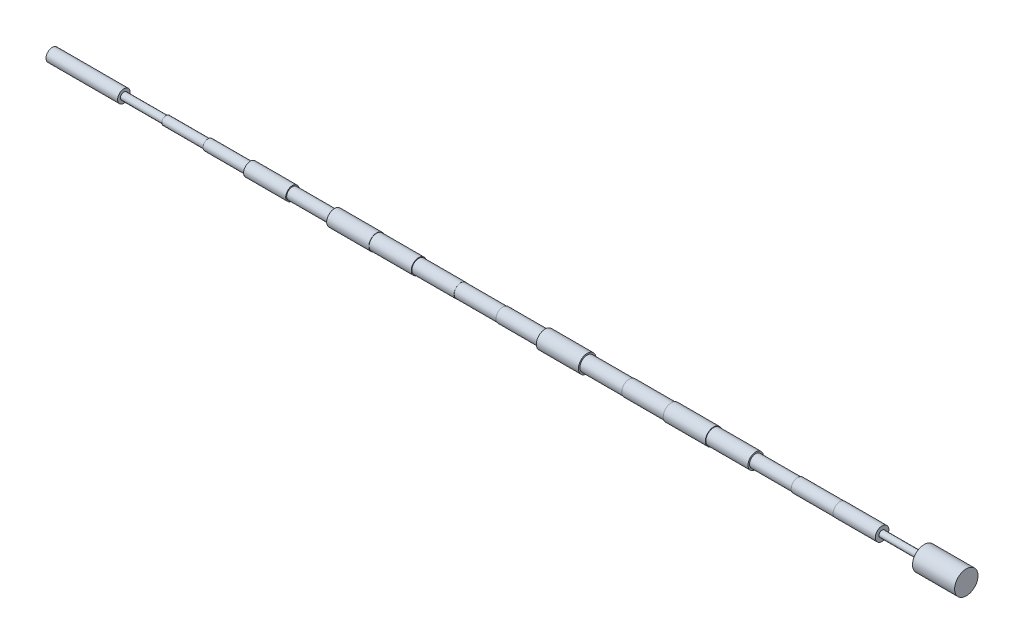
ISO-10303-21;
HEADER;
FILE_DESCRIPTION(('STEP AP214'),'2;1');
FILE_NAME('part.step','',(''),(''),'','','');
FILE_SCHEMA(('AUTOMOTIVE_DESIGN { 1 0 10303 214 1 1 1 1 }'));
ENDSEC;
DATA;
#1=APPLICATION_CONTEXT('core data for automotive mechanical design processes');
#2=APPLICATION_PROTOCOL_DEFINITION('international standard','automotive_design',2000,#1);
#3=PRODUCT_CONTEXT('',#1,'mechanical');
#4=PRODUCT('Part','Part','',(#3));
#5=PRODUCT_RELATED_PRODUCT_CATEGORY('part','',(#4));
#6=PRODUCT_DEFINITION_FORMATION('','',#4);
#7=PRODUCT_DEFINITION_CONTEXT('part definition',#1,'design');
#8=PRODUCT_DEFINITION('design','',#6,#7);
#9=PRODUCT_DEFINITION_SHAPE('','',#8);
#10=(LENGTH_UNIT() NAMED_UNIT(*) SI_UNIT(.MILLI.,.METRE.));
#11=(NAMED_UNIT(*) PLANE_ANGLE_UNIT() SI_UNIT($,.RADIAN.));
#12=(NAMED_UNIT(*) SI_UNIT($,.STERADIAN.) SOLID_ANGLE_UNIT());
#13=UNCERTAINTY_MEASURE_WITH_UNIT(LENGTH_MEASURE(1.E-05),#10,'distance_accuracy_value','');
#14=(GEOMETRIC_REPRESENTATION_CONTEXT(3) GLOBAL_UNCERTAINTY_ASSIGNED_CONTEXT((#13)) GLOBAL_UNIT_ASSIGNED_CONTEXT((#10,
#11,#12)) REPRESENTATION_CONTEXT('',''));
#15=CARTESIAN_POINT('',(0.,0.,0.));
#16=DIRECTION('',(0.,0.,1.));
#17=DIRECTION('',(1.,0.,0.));
#18=AXIS2_PLACEMENT_3D('',#15,#16,#17);
#19=CARTESIAN_POINT('',(200.,3.99073696845851E-12,0.));
#20=DIRECTION('',(-1.,0.,0.));
#21=DIRECTION('',(0.,0.,1.));
#22=AXIS2_PLACEMENT_3D('',#19,#20,#21);
#23=PLANE('',#22);
#24=CARTESIAN_POINT('',(200.,0.,0.));
#25=DIRECTION('',(-1.,0.,0.));
#26=DIRECTION('',(0.,0.,1.));
#27=AXIS2_PLACEMENT_3D('',#24,#25,#26);
#28=CIRCLE('',#27,2.782);
#29=CARTESIAN_POINT('',(200.,0.,2.782));
#30=VERTEX_POINT('',#29);
#31=EDGE_CURVE('E10',#30,#30,#28,.T.);
#32=ORIENTED_EDGE('',*,*,#31,.F.);
#33=EDGE_LOOP('',(#32));
#34=FACE_BOUND('',#33,.T.);
#35=ADVANCED_FACE('F41',(#34),#23,.F.);
#36=CARTESIAN_POINT('',(0.,0.,0.));
#37=DIRECTION('',(-1.,0.,0.));
#38=DIRECTION('',(0.,0.,1.));
#39=AXIS2_PLACEMENT_3D('',#36,#37,#38);
#40=CYLINDRICAL_SURFACE('',#39,2.782);
#41=ORIENTED_EDGE('',*,*,#31,.T.);
#42=EDGE_LOOP('',(#41));
#43=FACE_BOUND('',#42,.T.);
#44=CARTESIAN_POINT('',(190.,0.,0.));
#45=DIRECTION('',(-1.,0.,0.));
#46=DIRECTION('',(0.,0.,1.));
#47=AXIS2_PLACEMENT_3D('',#44,#45,#46);
#48=CIRCLE('',#47,2.782);
#49=CARTESIAN_POINT('',(190.,0.,2.782));
#50=VERTEX_POINT('',#49);
#51=EDGE_CURVE('E47',#50,#50,#48,.T.);
#52=ORIENTED_EDGE('',*,*,#51,.F.);
#53=EDGE_LOOP('',(#52));
#54=FACE_BOUND('',#53,.T.);
#55=ADVANCED_FACE('F193',(#43,#54),#40,.T.);
#56=CARTESIAN_POINT('',(190.,3.79120012003558E-12,0.));
#57=DIRECTION('',(-1.,0.,0.));
#58=DIRECTION('',(0.,0.,1.));
#59=AXIS2_PLACEMENT_3D('',#56,#57,#58);
#60=PLANE('',#59);
#61=ORIENTED_EDGE('',*,*,#51,.T.);
#62=EDGE_LOOP('',(#61));
#63=FACE_BOUND('',#62,.T.);
#64=CARTESIAN_POINT('',(190.,0.,0.));
#65=DIRECTION('',(-1.,0.,0.));
#66=DIRECTION('',(0.,0.,1.));
#67=AXIS2_PLACEMENT_3D('',#64,#65,#66);
#68=CIRCLE('',#67,0.738);
#69=CARTESIAN_POINT('',(190.,0.,0.738));
#70=VERTEX_POINT('',#69);
#71=EDGE_CURVE('E51',#70,#70,#68,.T.);
#72=ORIENTED_EDGE('',*,*,#71,.F.);
#73=EDGE_LOOP('',(#72));
#74=FACE_BOUND('',#73,.T.);
#75=ADVANCED_FACE('F198',(#63,#74),#60,.T.);
#76=CARTESIAN_POINT('',(0.,0.,0.));
#77=DIRECTION('',(-1.,0.,0.));
#78=DIRECTION('',(0.,0.,1.));
#79=AXIS2_PLACEMENT_3D('',#76,#77,#78);
#80=CYLINDRICAL_SURFACE('',#79,0.738);
#81=ORIENTED_EDGE('',*,*,#71,.T.);
#82=EDGE_LOOP('',(#81));
#83=FACE_BOUND('',#82,.T.);
#84=CARTESIAN_POINT('',(180.,0.,0.));
#85=DIRECTION('',(-1.,0.,0.));
#86=DIRECTION('',(0.,0.,1.));
#87=AXIS2_PLACEMENT_3D('',#84,#85,#86);
#88=CIRCLE('',#87,0.738);
#89=CARTESIAN_POINT('',(180.,0.,0.738));
#90=VERTEX_POINT('',#89);
#91=EDGE_CURVE('E55',#90,#90,#88,.T.);
#92=ORIENTED_EDGE('',*,*,#91,.F.);
#93=EDGE_LOOP('',(#92));
#94=FACE_BOUND('',#93,.T.);
#95=ADVANCED_FACE('F202',(#83,#94),#80,.T.);
#96=CARTESIAN_POINT('',(180.,6.21393483931991E-12,0.));
#97=DIRECTION('',(-1.,0.,0.));
#98=DIRECTION('',(0.,0.,1.));
#99=AXIS2_PLACEMENT_3D('',#96,#97,#98);
#100=PLANE('',#99);
#101=CARTESIAN_POINT('',(180.,0.,0.));
#102=DIRECTION('',(-1.,0.,0.));
#103=DIRECTION('',(0.,0.,1.));
#104=AXIS2_PLACEMENT_3D('',#101,#102,#103);
#105=CIRCLE('',#104,1.608);
#106=CARTESIAN_POINT('',(180.,0.,1.608));
#107=VERTEX_POINT('',#106);
#108=EDGE_CURVE('E60',#107,#107,#105,.T.);
#109=ORIENTED_EDGE('',*,*,#108,.F.);
#110=EDGE_LOOP('',(#109));
#111=FACE_BOUND('',#110,.T.);
#112=ORIENTED_EDGE('',*,*,#91,.T.);
#113=EDGE_LOOP('',(#112));
#114=FACE_BOUND('',#113,.T.);
#115=ADVANCED_FACE('F208',(#111,#114),#100,.F.);
#116=CARTESIAN_POINT('',(0.,0.,0.));
#117=DIRECTION('',(-1.,0.,0.));
#118=DIRECTION('',(0.,0.,1.));
#119=AXIS2_PLACEMENT_3D('',#116,#117,#118);
#120=CYLINDRICAL_SURFACE('',#119,1.608);
#121=ORIENTED_EDGE('',*,*,#108,.T.);
#122=EDGE_LOOP('',(#121));
#123=FACE_BOUND('',#122,.T.);
#124=CARTESIAN_POINT('',(170.,0.,0.));
#125=DIRECTION('',(-1.,0.,0.));
#126=DIRECTION('',(0.,0.,1.));
#127=AXIS2_PLACEMENT_3D('',#124,#125,#126);
#128=CIRCLE('',#127,1.608);
#129=CARTESIAN_POINT('',(170.,0.,1.608));
#130=VERTEX_POINT('',#129);
#131=EDGE_CURVE('E63',#130,#130,#128,.T.);
#132=ORIENTED_EDGE('',*,*,#131,.F.);
#133=EDGE_LOOP('',(#132));
#134=FACE_BOUND('',#133,.T.);
#135=ADVANCED_FACE('F212',(#123,#134),#120,.T.);
#136=CARTESIAN_POINT('',(170.,5.86871623713547E-12,0.));
#137=DIRECTION('',(-1.,0.,0.));
#138=DIRECTION('',(0.,0.,1.));
#139=AXIS2_PLACEMENT_3D('',#136,#137,#138);
#140=PLANE('',#139);
#141=ORIENTED_EDGE('',*,*,#131,.T.);
#142=EDGE_LOOP('',(#141));
#143=FACE_BOUND('',#142,.T.);
#144=CARTESIAN_POINT('',(170.,0.,0.));
#145=DIRECTION('',(-1.,0.,0.));
#146=DIRECTION('',(0.,0.,1.));
#147=AXIS2_PLACEMENT_3D('',#144,#145,#146);
#148=CIRCLE('',#147,1.573);
#149=CARTESIAN_POINT('',(170.,0.,1.573));
#150=VERTEX_POINT('',#149);
#151=EDGE_CURVE('E66',#150,#150,#148,.T.);
#152=ORIENTED_EDGE('',*,*,#151,.F.);
#153=EDGE_LOOP('',(#152));
#154=FACE_BOUND('',#153,.T.);
#155=ADVANCED_FACE('F216',(#143,#154),#140,.T.);
#156=CARTESIAN_POINT('',(0.,0.,0.));
#157=DIRECTION('',(-1.,0.,0.));
#158=DIRECTION('',(0.,0.,1.));
#159=AXIS2_PLACEMENT_3D('',#156,#157,#158);
#160=CYLINDRICAL_SURFACE('',#159,1.573);
#161=ORIENTED_EDGE('',*,*,#151,.T.);
#162=EDGE_LOOP('',(#161));
#163=FACE_BOUND('',#162,.T.);
#164=CARTESIAN_POINT('',(160.,0.,0.));
#165=DIRECTION('',(-1.,0.,0.));
#166=DIRECTION('',(0.,0.,1.));
#167=AXIS2_PLACEMENT_3D('',#164,#165,#166);
#168=CIRCLE('',#167,1.573);
#169=CARTESIAN_POINT('',(160.,0.,1.573));
#170=VERTEX_POINT('',#169);
#171=EDGE_CURVE('E69',#170,#170,#168,.T.);
#172=ORIENTED_EDGE('',*,*,#171,.F.);
#173=EDGE_LOOP('',(#172));
#174=FACE_BOUND('',#173,.T.);
#175=ADVANCED_FACE('F220',(#163,#174),#160,.T.);
#176=CARTESIAN_POINT('',(160.,5.64639809090989E-12,0.));
#177=DIRECTION('',(-1.,0.,0.));
#178=DIRECTION('',(0.,0.,1.));
#179=AXIS2_PLACEMENT_3D('',#176,#177,#178);
#180=PLANE('',#179);
#181=ORIENTED_EDGE('',*,*,#171,.T.);
#182=EDGE_LOOP('',(#181));
#183=FACE_BOUND('',#182,.T.);
#184=CARTESIAN_POINT('',(160.,0.,0.));
#185=DIRECTION('',(-1.,0.,0.));
#186=DIRECTION('',(0.,0.,1.));
#187=AXIS2_PLACEMENT_3D('',#184,#185,#186);
#188=CIRCLE('',#187,1.458);
#189=CARTESIAN_POINT('',(160.,0.,1.458));
#190=VERTEX_POINT('',#189);
#191=EDGE_CURVE('E72',#190,#190,#188,.T.);
#192=ORIENTED_EDGE('',*,*,#191,.F.);
#193=EDGE_LOOP('',(#192));
#194=FACE_BOUND('',#193,.T.);
#195=ADVANCED_FACE('F224',(#183,#194),#180,.T.);
#196=CARTESIAN_POINT('',(0.,0.,0.));
#197=DIRECTION('',(-1.,0.,0.));
#198=DIRECTION('',(0.,0.,1.));
#199=AXIS2_PLACEMENT_3D('',#196,#197,#198);
#200=CYLINDRICAL_SURFACE('',#199,1.458);
#201=ORIENTED_EDGE('',*,*,#191,.T.);
#202=EDGE_LOOP('',(#201));
#203=FACE_BOUND('',#202,.T.);
#204=CARTESIAN_POINT('',(150.,0.,0.));
#205=DIRECTION('',(-1.,0.,0.));
#206=DIRECTION('',(0.,0.,1.));
#207=AXIS2_PLACEMENT_3D('',#204,#205,#206);
#208=CIRCLE('',#207,1.458);
#209=CARTESIAN_POINT('',(150.,0.,1.458));
#210=VERTEX_POINT('',#209);
#211=EDGE_CURVE('E75',#210,#210,#208,.T.);
#212=ORIENTED_EDGE('',*,*,#211,.F.);
#213=EDGE_LOOP('',(#212));
#214=FACE_BOUND('',#213,.T.);
#215=ADVANCED_FACE('F228',(#203,#214),#200,.T.);
#216=CARTESIAN_POINT('',(150.,4.56006171122052E-12,0.));
#217=DIRECTION('',(-1.,0.,0.));
#218=DIRECTION('',(0.,0.,1.));
#219=AXIS2_PLACEMENT_3D('',#216,#217,#218);
#220=PLANE('',#219);
#221=CARTESIAN_POINT('',(150.,0.,0.));
#222=DIRECTION('',(-1.,0.,0.));
#223=DIRECTION('',(0.,0.,1.));
#224=AXIS2_PLACEMENT_3D('',#221,#222,#223);
#225=CIRCLE('',#224,1.826);
#226=CARTESIAN_POINT('',(150.,0.,1.826));
#227=VERTEX_POINT('',#226);
#228=EDGE_CURVE('E78',#227,#227,#225,.T.);
#229=ORIENTED_EDGE('',*,*,#228,.F.);
#230=EDGE_LOOP('',(#229));
#231=FACE_BOUND('',#230,.T.);
#232=ORIENTED_EDGE('',*,*,#211,.T.);
#233=EDGE_LOOP('',(#232));
#234=FACE_BOUND('',#233,.T.);
#235=ADVANCED_FACE('F232',(#231,#234),#220,.F.);
#236=CARTESIAN_POINT('',(0.,0.,0.));
#237=DIRECTION('',(-1.,0.,0.));
#238=DIRECTION('',(0.,0.,1.));
#239=AXIS2_PLACEMENT_3D('',#236,#237,#238);
#240=CYLINDRICAL_SURFACE('',#239,1.826);
#241=ORIENTED_EDGE('',*,*,#228,.T.);
#242=EDGE_LOOP('',(#241));
#243=FACE_BOUND('',#242,.T.);
#244=CARTESIAN_POINT('',(140.,0.,0.));
#245=DIRECTION('',(-1.,0.,0.));
#246=DIRECTION('',(0.,0.,1.));
#247=AXIS2_PLACEMENT_3D('',#244,#245,#246);
#248=CIRCLE('',#247,1.826);
#249=CARTESIAN_POINT('',(140.,0.,1.826));
#250=VERTEX_POINT('',#249);
#251=EDGE_CURVE('E81',#250,#250,#248,.T.);
#252=ORIENTED_EDGE('',*,*,#251,.F.);
#253=EDGE_LOOP('',(#252));
#254=FACE_BOUND('',#253,.T.);
#255=ADVANCED_FACE('F236',(#243,#254),#240,.T.);
#256=CARTESIAN_POINT('',(140.,5.9567408066245E-12,0.));
#257=DIRECTION('',(-1.,0.,0.));
#258=DIRECTION('',(0.,0.,1.));
#259=AXIS2_PLACEMENT_3D('',#256,#257,#258);
#260=PLANE('',#259);
#261=CARTESIAN_POINT('',(140.,0.,0.));
#262=DIRECTION('',(-1.,0.,0.));
#263=DIRECTION('',(0.,0.,1.));
#264=AXIS2_PLACEMENT_3D('',#261,#262,#263);
#265=CIRCLE('',#264,1.957);
#266=CARTESIAN_POINT('',(140.,0.,1.957));
#267=VERTEX_POINT('',#266);
#268=EDGE_CURVE('E84',#267,#267,#265,.T.);
#269=ORIENTED_EDGE('',*,*,#268,.F.);
#270=EDGE_LOOP('',(#269));
#271=FACE_BOUND('',#270,.T.);
#272=ORIENTED_EDGE('',*,*,#251,.T.);
#273=EDGE_LOOP('',(#272));
#274=FACE_BOUND('',#273,.T.);
#275=ADVANCED_FACE('F240',(#271,#274),#260,.F.);
#276=CARTESIAN_POINT('',(0.,0.,0.));
#277=DIRECTION('',(-1.,0.,0.));
#278=DIRECTION('',(0.,0.,1.));
#279=AXIS2_PLACEMENT_3D('',#276,#277,#278);
#280=CYLINDRICAL_SURFACE('',#279,1.957);
#281=ORIENTED_EDGE('',*,*,#268,.T.);
#282=EDGE_LOOP('',(#281));
#283=FACE_BOUND('',#282,.T.);
#284=CARTESIAN_POINT('',(130.,0.,0.));
#285=DIRECTION('',(-1.,0.,0.));
#286=DIRECTION('',(0.,0.,1.));
#287=AXIS2_PLACEMENT_3D('',#284,#285,#286);
#288=CIRCLE('',#287,1.957);
#289=CARTESIAN_POINT('',(130.,0.,1.957));
#290=VERTEX_POINT('',#289);
#291=EDGE_CURVE('E87',#290,#290,#288,.T.);
#292=ORIENTED_EDGE('',*,*,#291,.F.);
#293=EDGE_LOOP('',(#292));
#294=FACE_BOUND('',#293,.T.);
#295=ADVANCED_FACE('F244',(#283,#294),#280,.T.);
#296=CARTESIAN_POINT('',(130.,5.53125932043704E-12,0.));
#297=DIRECTION('',(-1.,0.,0.));
#298=DIRECTION('',(0.,0.,1.));
#299=AXIS2_PLACEMENT_3D('',#296,#297,#298);
#300=PLANE('',#299);
#301=ORIENTED_EDGE('',*,*,#291,.T.);
#302=EDGE_LOOP('',(#301));
#303=FACE_BOUND('',#302,.T.);
#304=CARTESIAN_POINT('',(130.,0.,0.));
#305=DIRECTION('',(-1.,0.,0.));
#306=DIRECTION('',(0.,0.,1.));
#307=AXIS2_PLACEMENT_3D('',#304,#305,#306);
#308=CIRCLE('',#307,1.808);
#309=CARTESIAN_POINT('',(130.,0.,1.808));
#310=VERTEX_POINT('',#309);
#311=EDGE_CURVE('E90',#310,#310,#308,.T.);
#312=ORIENTED_EDGE('',*,*,#311,.F.);
#313=EDGE_LOOP('',(#312));
#314=FACE_BOUND('',#313,.T.);
#315=ADVANCED_FACE('F248',(#303,#314),#300,.T.);
#316=CARTESIAN_POINT('',(0.,0.,0.));
#317=DIRECTION('',(-1.,0.,0.));
#318=DIRECTION('',(0.,0.,1.));
#319=AXIS2_PLACEMENT_3D('',#316,#317,#318);
#320=CYLINDRICAL_SURFACE('',#319,1.808);
#321=ORIENTED_EDGE('',*,*,#311,.T.);
#322=EDGE_LOOP('',(#321));
#323=FACE_BOUND('',#322,.T.);
#324=CARTESIAN_POINT('',(120.,0.,0.));
#325=DIRECTION('',(-1.,0.,0.));
#326=DIRECTION('',(0.,0.,1.));
#327=AXIS2_PLACEMENT_3D('',#324,#325,#326);
#328=CIRCLE('',#327,1.808);
#329=CARTESIAN_POINT('',(120.,0.,1.808));
#330=VERTEX_POINT('',#329);
#331=EDGE_CURVE('E93',#330,#330,#328,.T.);
#332=ORIENTED_EDGE('',*,*,#331,.F.);
#333=EDGE_LOOP('',(#332));
#334=FACE_BOUND('',#333,.T.);
#335=ADVANCED_FACE('F252',(#323,#334),#320,.T.);
#336=CARTESIAN_POINT('',(120.,3.68436844455251E-12,0.));
#337=DIRECTION('',(-1.,0.,0.));
#338=DIRECTION('',(0.,0.,1.));
#339=AXIS2_PLACEMENT_3D('',#336,#337,#338);
#340=PLANE('',#339);
#341=ORIENTED_EDGE('',*,*,#331,.T.);
#342=EDGE_LOOP('',(#341));
#343=FACE_BOUND('',#342,.T.);
#344=CARTESIAN_POINT('',(120.,0.,0.));
#345=DIRECTION('',(-1.,0.,0.));
#346=DIRECTION('',(0.,0.,1.));
#347=AXIS2_PLACEMENT_3D('',#344,#345,#346);
#348=CIRCLE('',#347,1.737);
#349=CARTESIAN_POINT('',(120.,0.,1.737));
#350=VERTEX_POINT('',#349);
#351=EDGE_CURVE('E96',#350,#350,#348,.T.);
#352=ORIENTED_EDGE('',*,*,#351,.F.);
#353=EDGE_LOOP('',(#352));
#354=FACE_BOUND('',#353,.T.);
#355=ADVANCED_FACE('F256',(#343,#354),#340,.T.);
#356=CARTESIAN_POINT('',(0.,0.,0.));
#357=DIRECTION('',(-1.,0.,0.));
#358=DIRECTION('',(0.,0.,1.));
#359=AXIS2_PLACEMENT_3D('',#356,#357,#358);
#360=CYLINDRICAL_SURFACE('',#359,1.737);
#361=ORIENTED_EDGE('',*,*,#351,.T.);
#362=EDGE_LOOP('',(#361));
#363=FACE_BOUND('',#362,.T.);
#364=CARTESIAN_POINT('',(110.,0.,0.));
#365=DIRECTION('',(-1.,0.,0.));
#366=DIRECTION('',(0.,0.,1.));
#367=AXIS2_PLACEMENT_3D('',#364,#365,#366);
#368=CIRCLE('',#367,1.737);
#369=CARTESIAN_POINT('',(110.,0.,1.737));
#370=VERTEX_POINT('',#369);
#371=EDGE_CURVE('E99',#370,#370,#368,.T.);
#372=ORIENTED_EDGE('',*,*,#371,.F.);
#373=EDGE_LOOP('',(#372));
#374=FACE_BOUND('',#373,.T.);
#375=ADVANCED_FACE('F260',(#363,#374),#360,.T.);
#376=CARTESIAN_POINT('',(110.,2.91884638405275E-12,0.));
#377=DIRECTION('',(-1.,0.,0.));
#378=DIRECTION('',(0.,0.,1.));
#379=AXIS2_PLACEMENT_3D('',#376,#377,#378);
#380=PLANE('',#379);
#381=CARTESIAN_POINT('',(110.,0.,0.));
#382=DIRECTION('',(-1.,0.,0.));
#383=DIRECTION('',(0.,0.,1.));
#384=AXIS2_PLACEMENT_3D('',#381,#382,#383);
#385=CIRCLE('',#384,2.092);
#386=CARTESIAN_POINT('',(110.,0.,2.092));
#387=VERTEX_POINT('',#386);
#388=EDGE_CURVE('E102',#387,#387,#385,.T.);
#389=ORIENTED_EDGE('',*,*,#388,.F.);
#390=EDGE_LOOP('',(#389));
#391=FACE_BOUND('',#390,.T.);
#392=ORIENTED_EDGE('',*,*,#371,.T.);
#393=EDGE_LOOP('',(#392));
#394=FACE_BOUND('',#393,.T.);
#395=ADVANCED_FACE('F264',(#391,#394),#380,.F.);
#396=CARTESIAN_POINT('',(0.,0.,0.));
#397=DIRECTION('',(-1.,0.,0.));
#398=DIRECTION('',(0.,0.,1.));
#399=AXIS2_PLACEMENT_3D('',#396,#397,#398);
#400=CYLINDRICAL_SURFACE('',#399,2.092);
#401=ORIENTED_EDGE('',*,*,#388,.T.);
#402=EDGE_LOOP('',(#401));
#403=FACE_BOUND('',#402,.T.);
#404=CARTESIAN_POINT('',(100.,0.,0.));
#405=DIRECTION('',(-1.,0.,0.));
#406=DIRECTION('',(0.,0.,1.));
#407=AXIS2_PLACEMENT_3D('',#404,#405,#406);
#408=CIRCLE('',#407,2.092);
#409=CARTESIAN_POINT('',(100.,0.,2.092));
#410=VERTEX_POINT('',#409);
#411=EDGE_CURVE('E105',#410,#410,#408,.T.);
#412=ORIENTED_EDGE('',*,*,#411,.F.);
#413=EDGE_LOOP('',(#412));
#414=FACE_BOUND('',#413,.T.);
#415=ADVANCED_FACE('F268',(#403,#414),#400,.T.);
#416=CARTESIAN_POINT('',(100.,2.65349671277523E-12,0.));
#417=DIRECTION('',(-1.,0.,0.));
#418=DIRECTION('',(0.,0.,1.));
#419=AXIS2_PLACEMENT_3D('',#416,#417,#418);
#420=PLANE('',#419);
#421=ORIENTED_EDGE('',*,*,#411,.T.);
#422=EDGE_LOOP('',(#421));
#423=FACE_BOUND('',#422,.T.);
#424=CARTESIAN_POINT('',(100.,0.,0.));
#425=DIRECTION('',(-1.,0.,0.));
#426=DIRECTION('',(0.,0.,1.));
#427=AXIS2_PLACEMENT_3D('',#424,#425,#426);
#428=CIRCLE('',#427,1.655);
#429=CARTESIAN_POINT('',(100.,0.,1.655));
#430=VERTEX_POINT('',#429);
#431=EDGE_CURVE('E108',#430,#430,#428,.T.);
#432=ORIENTED_EDGE('',*,*,#431,.F.);
#433=EDGE_LOOP('',(#432));
#434=FACE_BOUND('',#433,.T.);
#435=ADVANCED_FACE('F272',(#423,#434),#420,.T.);
#436=CARTESIAN_POINT('',(0.,0.,0.));
#437=DIRECTION('',(-1.,0.,0.));
#438=DIRECTION('',(0.,0.,1.));
#439=AXIS2_PLACEMENT_3D('',#436,#437,#438);
#440=CYLINDRICAL_SURFACE('',#439,1.655);
#441=ORIENTED_EDGE('',*,*,#431,.T.);
#442=EDGE_LOOP('',(#441));
#443=FACE_BOUND('',#442,.T.);
#444=CARTESIAN_POINT('',(90.,0.,0.));
#445=DIRECTION('',(-1.,0.,0.));
#446=DIRECTION('',(0.,0.,1.));
#447=AXIS2_PLACEMENT_3D('',#444,#445,#446);
#448=CIRCLE('',#447,1.655);
#449=CARTESIAN_POINT('',(90.,0.,1.655));
#450=VERTEX_POINT('',#449);
#451=EDGE_CURVE('E111',#450,#450,#448,.T.);
#452=ORIENTED_EDGE('',*,*,#451,.F.);
#453=EDGE_LOOP('',(#452));
#454=FACE_BOUND('',#453,.T.);
#455=ADVANCED_FACE('F276',(#443,#454),#440,.T.);
#456=CARTESIAN_POINT('',(90.,3.01873329958502E-12,0.));
#457=DIRECTION('',(-1.,0.,0.));
#458=DIRECTION('',(0.,0.,1.));
#459=AXIS2_PLACEMENT_3D('',#456,#457,#458);
#460=PLANE('',#459);
#461=ORIENTED_EDGE('',*,*,#451,.T.);
#462=EDGE_LOOP('',(#461));
#463=FACE_BOUND('',#462,.T.);
#464=CARTESIAN_POINT('',(90.,0.,0.));
#465=DIRECTION('',(-1.,0.,0.));
#466=DIRECTION('',(0.,0.,1.));
#467=AXIS2_PLACEMENT_3D('',#464,#465,#466);
#468=CIRCLE('',#467,1.581);
#469=CARTESIAN_POINT('',(90.,0.,1.581));
#470=VERTEX_POINT('',#469);
#471=EDGE_CURVE('E114',#470,#470,#468,.T.);
#472=ORIENTED_EDGE('',*,*,#471,.F.);
#473=EDGE_LOOP('',(#472));
#474=FACE_BOUND('',#473,.T.);
#475=ADVANCED_FACE('F280',(#463,#474),#460,.T.);
#476=CARTESIAN_POINT('',(0.,0.,0.));
#477=DIRECTION('',(-1.,0.,0.));
#478=DIRECTION('',(0.,0.,1.));
#479=AXIS2_PLACEMENT_3D('',#476,#477,#478);
#480=CYLINDRICAL_SURFACE('',#479,1.581);
#481=ORIENTED_EDGE('',*,*,#471,.T.);
#482=EDGE_LOOP('',(#481));
#483=FACE_BOUND('',#482,.T.);
#484=CARTESIAN_POINT('',(80.,0.,0.));
#485=DIRECTION('',(-1.,0.,0.));
#486=DIRECTION('',(0.,0.,1.));
#487=AXIS2_PLACEMENT_3D('',#484,#485,#486);
#488=CIRCLE('',#487,1.581);
#489=CARTESIAN_POINT('',(80.,0.,1.581));
#490=VERTEX_POINT('',#489);
#491=EDGE_CURVE('E117',#490,#490,#488,.T.);
#492=ORIENTED_EDGE('',*,*,#491,.F.);
#493=EDGE_LOOP('',(#492));
#494=FACE_BOUND('',#493,.T.);
#495=ADVANCED_FACE('F284',(#483,#494),#480,.T.);
#496=CARTESIAN_POINT('',(80.,2.05216825254188E-12,0.));
#497=DIRECTION('',(-1.,0.,0.));
#498=DIRECTION('',(0.,0.,1.));
#499=AXIS2_PLACEMENT_3D('',#496,#497,#498);
#500=PLANE('',#499);
#501=CARTESIAN_POINT('',(80.,0.,0.));
#502=DIRECTION('',(-1.,0.,0.));
#503=DIRECTION('',(0.,0.,1.));
#504=AXIS2_PLACEMENT_3D('',#501,#502,#503);
#505=CIRCLE('',#504,1.623);
#506=CARTESIAN_POINT('',(80.,0.,1.623));
#507=VERTEX_POINT('',#506);
#508=EDGE_CURVE('E120',#507,#507,#505,.T.);
#509=ORIENTED_EDGE('',*,*,#508,.F.);
#510=EDGE_LOOP('',(#509));
#511=FACE_BOUND('',#510,.T.);
#512=ORIENTED_EDGE('',*,*,#491,.T.);
#513=EDGE_LOOP('',(#512));
#514=FACE_BOUND('',#513,.T.);
#515=ADVANCED_FACE('F288',(#511,#514),#500,.F.);
#516=CARTESIAN_POINT('',(0.,0.,0.));
#517=DIRECTION('',(-1.,0.,0.));
#518=DIRECTION('',(0.,0.,1.));
#519=AXIS2_PLACEMENT_3D('',#516,#517,#518);
#520=CYLINDRICAL_SURFACE('',#519,1.623);
#521=ORIENTED_EDGE('',*,*,#508,.T.);
#522=EDGE_LOOP('',(#521));
#523=FACE_BOUND('',#522,.T.);
#524=CARTESIAN_POINT('',(70.,0.,0.));
#525=DIRECTION('',(-1.,0.,0.));
#526=DIRECTION('',(0.,0.,1.));
#527=AXIS2_PLACEMENT_3D('',#524,#525,#526);
#528=CIRCLE('',#527,1.623);
#529=CARTESIAN_POINT('',(70.,0.,1.623));
#530=VERTEX_POINT('',#529);
#531=EDGE_CURVE('E123',#530,#530,#528,.T.);
#532=ORIENTED_EDGE('',*,*,#531,.F.);
#533=EDGE_LOOP('',(#532));
#534=FACE_BOUND('',#533,.T.);
#535=ADVANCED_FACE('F292',(#523,#534),#520,.T.);
#536=CARTESIAN_POINT('',(70.,1.08967486993496E-12,0.));
#537=DIRECTION('',(-1.,0.,0.));
#538=DIRECTION('',(0.,0.,1.));
#539=AXIS2_PLACEMENT_3D('',#536,#537,#538);
#540=PLANE('',#539);
#541=CARTESIAN_POINT('',(70.,0.,0.));
#542=DIRECTION('',(-1.,0.,0.));
#543=DIRECTION('',(0.,0.,1.));
#544=AXIS2_PLACEMENT_3D('',#541,#542,#543);
#545=CIRCLE('',#544,1.783);
#546=CARTESIAN_POINT('',(70.,0.,1.783));
#547=VERTEX_POINT('',#546);
#548=EDGE_CURVE('E126',#547,#547,#545,.T.);
#549=ORIENTED_EDGE('',*,*,#548,.F.);
#550=EDGE_LOOP('',(#549));
#551=FACE_BOUND('',#550,.T.);
#552=ORIENTED_EDGE('',*,*,#531,.T.);
#553=EDGE_LOOP('',(#552));
#554=FACE_BOUND('',#553,.T.);
#555=ADVANCED_FACE('F296',(#551,#554),#540,.F.);
#556=CARTESIAN_POINT('',(0.,0.,0.));
#557=DIRECTION('',(-1.,0.,0.));
#558=DIRECTION('',(0.,0.,1.));
#559=AXIS2_PLACEMENT_3D('',#556,#557,#558);
#560=CYLINDRICAL_SURFACE('',#559,1.783);
#561=ORIENTED_EDGE('',*,*,#548,.T.);
#562=EDGE_LOOP('',(#561));
#563=FACE_BOUND('',#562,.T.);
#564=CARTESIAN_POINT('',(60.,0.,0.));
#565=DIRECTION('',(-1.,0.,0.));
#566=DIRECTION('',(0.,0.,1.));
#567=AXIS2_PLACEMENT_3D('',#564,#565,#566);
#568=CIRCLE('',#567,1.783);
#569=CARTESIAN_POINT('',(60.,0.,1.783));
#570=VERTEX_POINT('',#569);
#571=EDGE_CURVE('E129',#570,#570,#568,.T.);
#572=ORIENTED_EDGE('',*,*,#571,.F.);
#573=EDGE_LOOP('',(#572));
#574=FACE_BOUND('',#573,.T.);
#575=ADVANCED_FACE('F300',(#563,#574),#560,.T.);
#576=CARTESIAN_POINT('',(60.,2.22996054758668E-13,0.));
#577=DIRECTION('',(-1.,0.,0.));
#578=DIRECTION('',(0.,0.,1.));
#579=AXIS2_PLACEMENT_3D('',#576,#577,#578);
#580=PLANE('',#579);
#581=CARTESIAN_POINT('',(60.,0.,0.));
#582=DIRECTION('',(-1.,0.,0.));
#583=DIRECTION('',(0.,0.,1.));
#584=AXIS2_PLACEMENT_3D('',#581,#582,#583);
#585=CIRCLE('',#584,1.867);
#586=CARTESIAN_POINT('',(60.,0.,1.867));
#587=VERTEX_POINT('',#586);
#588=EDGE_CURVE('E132',#587,#587,#585,.T.);
#589=ORIENTED_EDGE('',*,*,#588,.F.);
#590=EDGE_LOOP('',(#589));
#591=FACE_BOUND('',#590,.T.);
#592=ORIENTED_EDGE('',*,*,#571,.T.);
#593=EDGE_LOOP('',(#592));
#594=FACE_BOUND('',#593,.T.);
#595=ADVANCED_FACE('F304',(#591,#594),#580,.F.);
#596=CARTESIAN_POINT('',(0.,0.,0.));
#597=DIRECTION('',(-1.,0.,0.));
#598=DIRECTION('',(0.,0.,1.));
#599=AXIS2_PLACEMENT_3D('',#596,#597,#598);
#600=CYLINDRICAL_SURFACE('',#599,1.867);
#601=ORIENTED_EDGE('',*,*,#588,.T.);
#602=EDGE_LOOP('',(#601));
#603=FACE_BOUND('',#602,.T.);
#604=CARTESIAN_POINT('',(50.,0.,0.));
#605=DIRECTION('',(-1.,0.,0.));
#606=DIRECTION('',(0.,0.,1.));
#607=AXIS2_PLACEMENT_3D('',#604,#605,#606);
#608=CIRCLE('',#607,1.867);
#609=CARTESIAN_POINT('',(50.,0.,1.867));
#610=VERTEX_POINT('',#609);
#611=EDGE_CURVE('E135',#610,#610,#608,.T.);
#612=ORIENTED_EDGE('',*,*,#611,.F.);
#613=EDGE_LOOP('',(#612));
#614=FACE_BOUND('',#613,.T.);
#615=ADVANCED_FACE('F308',(#603,#614),#600,.T.);
#616=CARTESIAN_POINT('',(50.,1.85830045632224E-13,0.));
#617=DIRECTION('',(-1.,0.,0.));
#618=DIRECTION('',(0.,0.,1.));
#619=AXIS2_PLACEMENT_3D('',#616,#617,#618);
#620=PLANE('',#619);
#621=ORIENTED_EDGE('',*,*,#611,.T.);
#622=EDGE_LOOP('',(#621));
#623=FACE_BOUND('',#622,.T.);
#624=CARTESIAN_POINT('',(50.,0.,0.));
#625=DIRECTION('',(-1.,0.,0.));
#626=DIRECTION('',(0.,0.,1.));
#627=AXIS2_PLACEMENT_3D('',#624,#625,#626);
#628=CIRCLE('',#627,1.354);
#629=CARTESIAN_POINT('',(50.,0.,1.354));
#630=VERTEX_POINT('',#629);
#631=EDGE_CURVE('E138',#630,#630,#628,.T.);
#632=ORIENTED_EDGE('',*,*,#631,.F.);
#633=EDGE_LOOP('',(#632));
#634=FACE_BOUND('',#633,.T.);
#635=ADVANCED_FACE('F312',(#623,#634),#620,.T.);
#636=CARTESIAN_POINT('',(0.,0.,0.));
#637=DIRECTION('',(-1.,0.,0.));
#638=DIRECTION('',(0.,0.,1.));
#639=AXIS2_PLACEMENT_3D('',#636,#637,#638);
#640=CYLINDRICAL_SURFACE('',#639,1.354);
#641=ORIENTED_EDGE('',*,*,#631,.T.);
#642=EDGE_LOOP('',(#641));
#643=FACE_BOUND('',#642,.T.);
#644=CARTESIAN_POINT('',(40.,0.,0.));
#645=DIRECTION('',(-1.,0.,0.));
#646=DIRECTION('',(0.,0.,1.));
#647=AXIS2_PLACEMENT_3D('',#644,#645,#646);
#648=CIRCLE('',#647,1.354);
#649=CARTESIAN_POINT('',(40.,0.,1.354));
#650=VERTEX_POINT('',#649);
#651=EDGE_CURVE('E141',#650,#650,#648,.T.);
#652=ORIENTED_EDGE('',*,*,#651,.F.);
#653=EDGE_LOOP('',(#652));
#654=FACE_BOUND('',#653,.T.);
#655=ADVANCED_FACE('F316',(#643,#654),#640,.T.);
#656=CARTESIAN_POINT('',(40.,0.,0.));
#657=DIRECTION('',(-1.,0.,0.));
#658=DIRECTION('',(0.,0.,1.));
#659=AXIS2_PLACEMENT_3D('',#656,#657,#658);
#660=PLANE('',#659);
#661=CARTESIAN_POINT('',(40.,0.,0.));
#662=DIRECTION('',(-1.,0.,0.));
#663=DIRECTION('',(0.,0.,1.));
#664=AXIS2_PLACEMENT_3D('',#661,#662,#663);
#665=CIRCLE('',#664,1.59);
#666=CARTESIAN_POINT('',(40.,0.,1.59));
#667=VERTEX_POINT('',#666);
#668=EDGE_CURVE('E144',#667,#667,#665,.T.);
#669=ORIENTED_EDGE('',*,*,#668,.F.);
#670=EDGE_LOOP('',(#669));
#671=FACE_BOUND('',#670,.T.);
#672=ORIENTED_EDGE('',*,*,#651,.T.);
#673=EDGE_LOOP('',(#672));
#674=FACE_BOUND('',#673,.T.);
#675=ADVANCED_FACE('F320',(#671,#674),#660,.F.);
#676=CARTESIAN_POINT('',(0.,0.,0.));
#677=DIRECTION('',(-1.,0.,0.));
#678=DIRECTION('',(0.,0.,1.));
#679=AXIS2_PLACEMENT_3D('',#676,#677,#678);
#680=CYLINDRICAL_SURFACE('',#679,1.59);
#681=ORIENTED_EDGE('',*,*,#668,.T.);
#682=EDGE_LOOP('',(#681));
#683=FACE_BOUND('',#682,.T.);
#684=CARTESIAN_POINT('',(30.,0.,0.));
#685=DIRECTION('',(-1.,0.,0.));
#686=DIRECTION('',(0.,0.,1.));
#687=AXIS2_PLACEMENT_3D('',#684,#685,#686);
#688=CIRCLE('',#687,1.59);
#689=CARTESIAN_POINT('',(30.,0.,1.59));
#690=VERTEX_POINT('',#689);
#691=EDGE_CURVE('E147',#690,#690,#688,.T.);
#692=ORIENTED_EDGE('',*,*,#691,.F.);
#693=EDGE_LOOP('',(#692));
#694=FACE_BOUND('',#693,.T.);
#695=ADVANCED_FACE('F324',(#683,#694),#680,.T.);
#696=CARTESIAN_POINT('',(30.,0.,0.));
#697=DIRECTION('',(-1.,0.,0.));
#698=DIRECTION('',(0.,0.,1.));
#699=AXIS2_PLACEMENT_3D('',#696,#697,#698);
#700=PLANE('',#699);
#701=ORIENTED_EDGE('',*,*,#691,.T.);
#702=EDGE_LOOP('',(#701));
#703=FACE_BOUND('',#702,.T.);
#704=CARTESIAN_POINT('',(30.,0.,0.));
#705=DIRECTION('',(-1.,0.,0.));
#706=DIRECTION('',(0.,0.,1.));
#707=AXIS2_PLACEMENT_3D('',#704,#705,#706);
#708=CIRCLE('',#707,1.222);
#709=CARTESIAN_POINT('',(30.,0.,1.222));
#710=VERTEX_POINT('',#709);
#711=EDGE_CURVE('E150',#710,#710,#708,.T.);
#712=ORIENTED_EDGE('',*,*,#711,.F.);
#713=EDGE_LOOP('',(#712));
#714=FACE_BOUND('',#713,.T.);
#715=ADVANCED_FACE('F328',(#703,#714),#700,.T.);
#716=CARTESIAN_POINT('',(0.,0.,0.));
#717=DIRECTION('',(-1.,0.,0.));
#718=DIRECTION('',(0.,0.,1.));
#719=AXIS2_PLACEMENT_3D('',#716,#717,#718);
#720=CYLINDRICAL_SURFACE('',#719,1.222);
#721=ORIENTED_EDGE('',*,*,#711,.T.);
#722=EDGE_LOOP('',(#721));
#723=FACE_BOUND('',#722,.T.);
#724=CARTESIAN_POINT('',(20.,0.,0.));
#725=DIRECTION('',(-1.,0.,0.));
#726=DIRECTION('',(0.,0.,1.));
#727=AXIS2_PLACEMENT_3D('',#724,#725,#726);
#728=CIRCLE('',#727,1.222);
#729=CARTESIAN_POINT('',(20.,0.,1.222));
#730=VERTEX_POINT('',#729);
#731=EDGE_CURVE('E153',#730,#730,#728,.T.);
#732=ORIENTED_EDGE('',*,*,#731,.F.);
#733=EDGE_LOOP('',(#732));
#734=FACE_BOUND('',#733,.T.);
#735=ADVANCED_FACE('F332',(#723,#734),#720,.T.);
#736=CARTESIAN_POINT('',(20.,1.13566185006665E-13,0.));
#737=DIRECTION('',(-1.,0.,0.));
#738=DIRECTION('',(0.,0.,1.));
#739=AXIS2_PLACEMENT_3D('',#736,#737,#738);
#740=PLANE('',#739);
#741=ORIENTED_EDGE('',*,*,#731,.T.);
#742=EDGE_LOOP('',(#741));
#743=FACE_BOUND('',#742,.T.);
#744=CARTESIAN_POINT('',(20.,0.,0.));
#745=DIRECTION('',(-1.,0.,0.));
#746=DIRECTION('',(0.,0.,1.));
#747=AXIS2_PLACEMENT_3D('',#744,#745,#746);
#748=CIRCLE('',#747,1.008);
#749=CARTESIAN_POINT('',(20.,0.,1.008));
#750=VERTEX_POINT('',#749);
#751=EDGE_CURVE('E156',#750,#750,#748,.T.);
#752=ORIENTED_EDGE('',*,*,#751,.F.);
#753=EDGE_LOOP('',(#752));
#754=FACE_BOUND('',#753,.T.);
#755=ADVANCED_FACE('F336',(#743,#754),#740,.T.);
#756=CARTESIAN_POINT('',(0.,0.,0.));
#757=DIRECTION('',(-1.,0.,0.));
#758=DIRECTION('',(0.,0.,1.));
#759=AXIS2_PLACEMENT_3D('',#756,#757,#758);
#760=CYLINDRICAL_SURFACE('',#759,1.008);
#761=ORIENTED_EDGE('',*,*,#751,.T.);
#762=EDGE_LOOP('',(#761));
#763=FACE_BOUND('',#762,.T.);
#764=CARTESIAN_POINT('',(10.,0.,0.));
#765=DIRECTION('',(-1.,0.,0.));
#766=DIRECTION('',(0.,0.,1.));
#767=AXIS2_PLACEMENT_3D('',#764,#765,#766);
#768=CIRCLE('',#767,1.008);
#769=CARTESIAN_POINT('',(10.,0.,1.008));
#770=VERTEX_POINT('',#769);
#771=EDGE_CURVE('E159',#770,#770,#768,.T.);
#772=ORIENTED_EDGE('',*,*,#771,.F.);
#773=EDGE_LOOP('',(#772));
#774=FACE_BOUND('',#773,.T.);
#775=ADVANCED_FACE('F340',(#763,#774),#760,.T.);
#776=CARTESIAN_POINT('',(10.,0.,0.));
#777=DIRECTION('',(-1.,0.,0.));
#778=DIRECTION('',(0.,0.,1.));
#779=AXIS2_PLACEMENT_3D('',#776,#777,#778);
#780=PLANE('',#779);
#781=ORIENTED_EDGE('',*,*,#771,.T.);
#782=EDGE_LOOP('',(#781));
#783=FACE_BOUND('',#782,.T.);
#784=CARTESIAN_POINT('',(10.,0.,0.));
#785=DIRECTION('',(-1.,0.,0.));
#786=DIRECTION('',(0.,0.,1.));
#787=AXIS2_PLACEMENT_3D('',#784,#785,#786);
#788=CIRCLE('',#787,0.831);
#789=CARTESIAN_POINT('',(10.,0.,0.831));
#790=VERTEX_POINT('',#789);
#791=EDGE_CURVE('E162',#790,#790,#788,.T.);
#792=ORIENTED_EDGE('',*,*,#791,.F.);
#793=EDGE_LOOP('',(#792));
#794=FACE_BOUND('',#793,.T.);
#795=ADVANCED_FACE('F344',(#783,#794),#780,.T.);
#796=CARTESIAN_POINT('',(0.,0.,0.));
#797=DIRECTION('',(-1.,0.,0.));
#798=DIRECTION('',(0.,0.,1.));
#799=AXIS2_PLACEMENT_3D('',#796,#797,#798);
#800=CYLINDRICAL_SURFACE('',#799,0.831);
#801=ORIENTED_EDGE('',*,*,#791,.T.);
#802=EDGE_LOOP('',(#801));
#803=FACE_BOUND('',#802,.T.);
#804=CARTESIAN_POINT('',(0.,0.,0.));
#805=DIRECTION('',(-1.,0.,0.));
#806=DIRECTION('',(0.,0.,1.));
#807=AXIS2_PLACEMENT_3D('',#804,#805,#806);
#808=CIRCLE('',#807,0.831);
#809=CARTESIAN_POINT('',(0.,0.,0.831));
#810=VERTEX_POINT('',#809);
#811=EDGE_CURVE('E165',#810,#810,#808,.T.);
#812=ORIENTED_EDGE('',*,*,#811,.F.);
#813=EDGE_LOOP('',(#812));
#814=FACE_BOUND('',#813,.T.);
#815=ADVANCED_FACE('F180',(#803,#814),#800,.T.);
#816=CARTESIAN_POINT('',(-17.,0.,0.));
#817=DIRECTION('',(1.,0.,0.));
#818=DIRECTION('',(0.,0.,-1.));
#819=AXIS2_PLACEMENT_3D('',#816,#817,#818);
#820=CYLINDRICAL_SURFACE('',#819,1.5);
#821=CARTESIAN_POINT('',(-17.,0.,0.));
#822=DIRECTION('',(-1.,0.,0.));
#823=DIRECTION('',(0.,0.,1.));
#824=AXIS2_PLACEMENT_3D('',#821,#822,#823);
#825=CIRCLE('',#824,1.5);
#826=CARTESIAN_POINT('',(-17.,0.,1.5));
#827=VERTEX_POINT('',#826);
#828=EDGE_CURVE('E168',#827,#827,#825,.T.);
#829=ORIENTED_EDGE('',*,*,#828,.F.);
#830=EDGE_LOOP('',(#829));
#831=FACE_BOUND('',#830,.T.);
#832=CARTESIAN_POINT('',(0.,0.,0.));
#833=DIRECTION('',(-1.,0.,0.));
#834=DIRECTION('',(0.,0.,1.));
#835=AXIS2_PLACEMENT_3D('',#832,#833,#834);
#836=CIRCLE('',#835,1.5);
#837=CARTESIAN_POINT('',(0.,0.,1.5));
#838=VERTEX_POINT('',#837);
#839=EDGE_CURVE('E169',#838,#838,#836,.T.);
#840=ORIENTED_EDGE('',*,*,#839,.T.);
#841=EDGE_LOOP('',(#840));
#842=FACE_BOUND('',#841,.T.);
#843=ADVANCED_FACE('F177',(#831,#842),#820,.T.);
#844=CARTESIAN_POINT('',(-17.,0.,0.));
#845=DIRECTION('',(-1.,0.,0.));
#846=DIRECTION('',(0.,0.,1.));
#847=AXIS2_PLACEMENT_3D('',#844,#845,#846);
#848=PLANE('',#847);
#849=ORIENTED_EDGE('',*,*,#828,.T.);
#850=EDGE_LOOP('',(#849));
#851=FACE_BOUND('',#850,.T.);
#852=ADVANCED_FACE('F175',(#851),#848,.T.);
#853=CARTESIAN_POINT('',(0.,0.,0.));
#854=DIRECTION('',(-1.,0.,0.));
#855=DIRECTION('',(0.,0.,1.));
#856=AXIS2_PLACEMENT_3D('',#853,#854,#855);
#857=PLANE('',#856);
#858=ORIENTED_EDGE('',*,*,#811,.T.);
#859=EDGE_LOOP('',(#858));
#860=FACE_BOUND('',#859,.T.);
#861=ORIENTED_EDGE('',*,*,#839,.F.);
#862=EDGE_LOOP('',(#861));
#863=FACE_BOUND('',#862,.T.);
#864=ADVANCED_FACE('F184',(#860,#863),#857,.F.);
#865=CLOSED_SHELL('',(#35,#55,#75,#95,#115,#135,#155,#175,#195,#215,#235,#255,#275,#295,#315,
#335,#355,#375,#395,#415,#435,#455,#475,#495,#515,#535,#555,#575,#595,#615,#635,#655,#675,#695,
#715,#735,#755,#775,#795,#815,#843,#852,#864));
#866=MANIFOLD_SOLID_BREP('B2',#865);
#867=ADVANCED_BREP_SHAPE_REPRESENTATION('',(#18,#866),#14);
#868=SHAPE_DEFINITION_REPRESENTATION(#9,#867);
ENDSEC;
END-ISO-10303-21;
